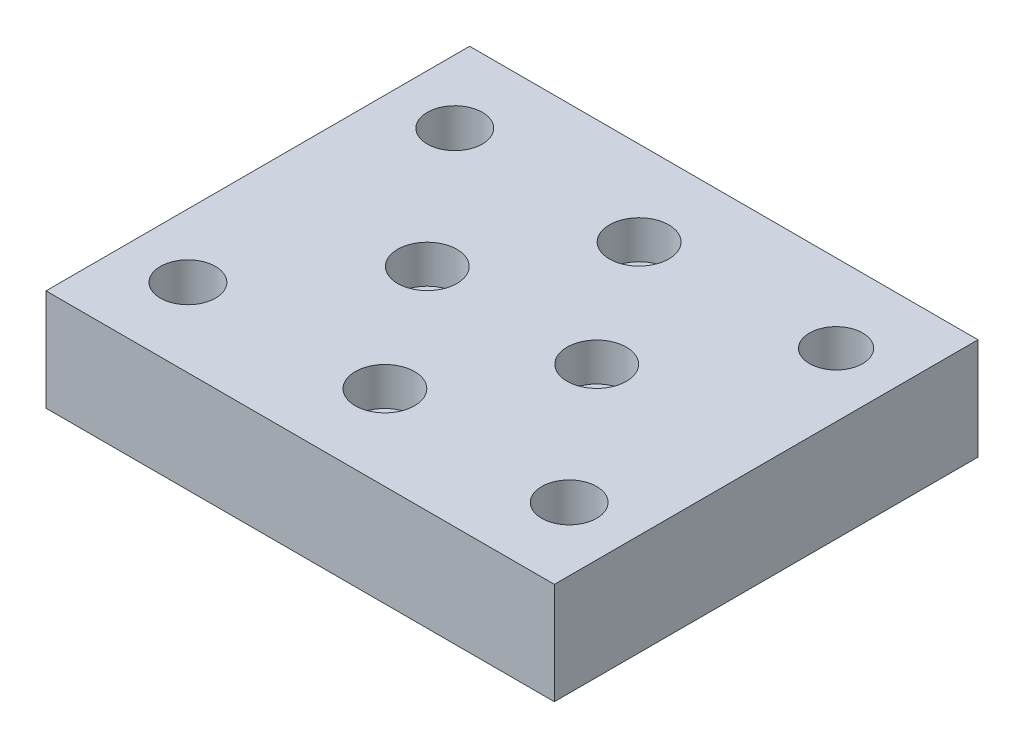
ISO-10303-21;
HEADER;
FILE_DESCRIPTION(('STEP AP214'),'2;1');
FILE_NAME('part.step','',(''),(''),'','','');
FILE_SCHEMA(('AUTOMOTIVE_DESIGN { 1 0 10303 214 1 1 1 1 }'));
ENDSEC;
DATA;
#1=APPLICATION_CONTEXT('core data for automotive mechanical design processes');
#2=APPLICATION_PROTOCOL_DEFINITION('international standard','automotive_design',2000,#1);
#3=PRODUCT_CONTEXT('',#1,'mechanical');
#4=PRODUCT('Part','Part','',(#3));
#5=PRODUCT_RELATED_PRODUCT_CATEGORY('part','',(#4));
#6=PRODUCT_DEFINITION_FORMATION('','',#4);
#7=PRODUCT_DEFINITION_CONTEXT('part definition',#1,'design');
#8=PRODUCT_DEFINITION('design','',#6,#7);
#9=PRODUCT_DEFINITION_SHAPE('','',#8);
#10=(LENGTH_UNIT() NAMED_UNIT(*) SI_UNIT(.MILLI.,.METRE.));
#11=(NAMED_UNIT(*) PLANE_ANGLE_UNIT() SI_UNIT($,.RADIAN.));
#12=(NAMED_UNIT(*) SI_UNIT($,.STERADIAN.) SOLID_ANGLE_UNIT());
#13=UNCERTAINTY_MEASURE_WITH_UNIT(LENGTH_MEASURE(1.E-05),#10,'distance_accuracy_value','');
#14=(GEOMETRIC_REPRESENTATION_CONTEXT(3) GLOBAL_UNCERTAINTY_ASSIGNED_CONTEXT((#13)) GLOBAL_UNIT_ASSIGNED_CONTEXT((#10,
#11,#12)) REPRESENTATION_CONTEXT('',''));
#15=CARTESIAN_POINT('',(0.,0.,0.));
#16=DIRECTION('',(0.,0.,1.));
#17=DIRECTION('',(1.,0.,0.));
#18=AXIS2_PLACEMENT_3D('',#15,#16,#17);
#19=CARTESIAN_POINT('',(-60.,24.,-50.));
#20=DIRECTION('',(1.,0.,0.));
#21=DIRECTION('',(0.,0.,-1.));
#22=AXIS2_PLACEMENT_3D('',#19,#20,#21);
#23=PLANE('',#22);
#24=DIRECTION('',(0.,0.,1.));
#25=VECTOR('',#24,1.);
#26=CARTESIAN_POINT('',(-60.,0.,-50.));
#27=LINE('',#26,#25);
#28=CARTESIAN_POINT('',(-60.,0.,-50.));
#29=VERTEX_POINT('',#28);
#30=CARTESIAN_POINT('',(-60.,0.,50.));
#31=VERTEX_POINT('',#30);
#32=EDGE_CURVE('E96',#29,#31,#27,.T.);
#33=ORIENTED_EDGE('',*,*,#32,.T.);
#34=DIRECTION('',(0.,-1.,0.));
#35=VECTOR('',#34,1.);
#36=CARTESIAN_POINT('',(-60.,24.,50.));
#37=LINE('',#36,#35);
#38=CARTESIAN_POINT('',(-60.,24.,50.));
#39=VERTEX_POINT('',#38);
#40=EDGE_CURVE('E11',#39,#31,#37,.T.);
#41=ORIENTED_EDGE('',*,*,#40,.F.);
#42=DIRECTION('',(0.,0.,1.));
#43=VECTOR('',#42,1.);
#44=CARTESIAN_POINT('',(-60.,24.,-50.));
#45=LINE('',#44,#43);
#46=CARTESIAN_POINT('',(-60.,24.,-50.));
#47=VERTEX_POINT('',#46);
#48=EDGE_CURVE('E84',#47,#39,#45,.T.);
#49=ORIENTED_EDGE('',*,*,#48,.F.);
#50=DIRECTION('',(0.,-1.,0.));
#51=VECTOR('',#50,1.);
#52=CARTESIAN_POINT('',(-60.,24.,-50.));
#53=LINE('',#52,#51);
#54=EDGE_CURVE('E92',#47,#29,#53,.T.);
#55=ORIENTED_EDGE('',*,*,#54,.T.);
#56=EDGE_LOOP('',(#33,#41,#49,#55));
#57=FACE_BOUND('',#56,.T.);
#58=ADVANCED_FACE('F33',(#57),#23,.F.);
#59=CARTESIAN_POINT('',(60.,24.,50.));
#60=DIRECTION('',(0.,0.,-1.));
#61=DIRECTION('',(-1.,0.,0.));
#62=AXIS2_PLACEMENT_3D('',#59,#60,#61);
#63=PLANE('',#62);
#64=DIRECTION('',(1.,0.,0.));
#65=VECTOR('',#64,1.);
#66=CARTESIAN_POINT('',(60.,0.,50.));
#67=LINE('',#66,#65);
#68=CARTESIAN_POINT('',(60.,0.,50.));
#69=VERTEX_POINT('',#68);
#70=EDGE_CURVE('E88',#31,#69,#67,.T.);
#71=ORIENTED_EDGE('',*,*,#70,.T.);
#72=DIRECTION('',(0.,-1.,0.));
#73=VECTOR('',#72,1.);
#74=CARTESIAN_POINT('',(60.,24.,50.));
#75=LINE('',#74,#73);
#76=CARTESIAN_POINT('',(60.,24.,50.));
#77=VERTEX_POINT('',#76);
#78=EDGE_CURVE('E41',#77,#69,#75,.T.);
#79=ORIENTED_EDGE('',*,*,#78,.F.);
#80=DIRECTION('',(1.,0.,0.));
#81=VECTOR('',#80,1.);
#82=CARTESIAN_POINT('',(60.,24.,50.));
#83=LINE('',#82,#81);
#84=EDGE_CURVE('E79',#39,#77,#83,.T.);
#85=ORIENTED_EDGE('',*,*,#84,.F.);
#86=ORIENTED_EDGE('',*,*,#40,.T.);
#87=EDGE_LOOP('',(#71,#79,#85,#86));
#88=FACE_BOUND('',#87,.T.);
#89=ADVANCED_FACE('F87',(#88),#63,.F.);
#90=CARTESIAN_POINT('',(60.,24.,-50.));
#91=DIRECTION('',(-1.,0.,0.));
#92=DIRECTION('',(0.,0.,1.));
#93=AXIS2_PLACEMENT_3D('',#90,#91,#92);
#94=PLANE('',#93);
#95=DIRECTION('',(0.,0.,-1.));
#96=VECTOR('',#95,1.);
#97=CARTESIAN_POINT('',(60.,0.,-50.));
#98=LINE('',#97,#96);
#99=CARTESIAN_POINT('',(60.,0.,-50.));
#100=VERTEX_POINT('',#99);
#101=EDGE_CURVE('E66',#69,#100,#98,.T.);
#102=ORIENTED_EDGE('',*,*,#101,.T.);
#103=DIRECTION('',(0.,-1.,0.));
#104=VECTOR('',#103,1.);
#105=CARTESIAN_POINT('',(60.,24.,-50.));
#106=LINE('',#105,#104);
#107=CARTESIAN_POINT('',(60.,24.,-50.));
#108=VERTEX_POINT('',#107);
#109=EDGE_CURVE('E89',#108,#100,#106,.T.);
#110=ORIENTED_EDGE('',*,*,#109,.F.);
#111=DIRECTION('',(0.,0.,-1.));
#112=VECTOR('',#111,1.);
#113=CARTESIAN_POINT('',(60.,24.,-50.));
#114=LINE('',#113,#112);
#115=EDGE_CURVE('E82',#77,#108,#114,.T.);
#116=ORIENTED_EDGE('',*,*,#115,.F.);
#117=ORIENTED_EDGE('',*,*,#78,.T.);
#118=EDGE_LOOP('',(#102,#110,#116,#117));
#119=FACE_BOUND('',#118,.T.);
#120=ADVANCED_FACE('F90',(#119),#94,.F.);
#121=CARTESIAN_POINT('',(60.,24.,-50.));
#122=DIRECTION('',(0.,0.,1.));
#123=DIRECTION('',(1.,0.,0.));
#124=AXIS2_PLACEMENT_3D('',#121,#122,#123);
#125=PLANE('',#124);
#126=DIRECTION('',(-1.,0.,0.));
#127=VECTOR('',#126,1.);
#128=CARTESIAN_POINT('',(60.,0.,-50.));
#129=LINE('',#128,#127);
#130=EDGE_CURVE('E72',#100,#29,#129,.T.);
#131=ORIENTED_EDGE('',*,*,#130,.T.);
#132=ORIENTED_EDGE('',*,*,#54,.F.);
#133=DIRECTION('',(-1.,0.,0.));
#134=VECTOR('',#133,1.);
#135=CARTESIAN_POINT('',(60.,24.,-50.));
#136=LINE('',#135,#134);
#137=EDGE_CURVE('E49',#108,#47,#136,.T.);
#138=ORIENTED_EDGE('',*,*,#137,.F.);
#139=ORIENTED_EDGE('',*,*,#109,.T.);
#140=EDGE_LOOP('',(#131,#132,#138,#139));
#141=FACE_BOUND('',#140,.T.);
#142=ADVANCED_FACE('F104',(#141),#125,.F.);
#143=CARTESIAN_POINT('',(0.,24.,0.));
#144=DIRECTION('',(0.,-1.,0.));
#145=DIRECTION('',(0.,0.,-1.));
#146=AXIS2_PLACEMENT_3D('',#143,#144,#145);
#147=PLANE('',#146);
#148=CARTESIAN_POINT('',(45.,24.,-31.5));
#149=DIRECTION('',(0.,-1.,0.));
#150=DIRECTION('',(0.,0.,-1.));
#151=AXIS2_PLACEMENT_3D('',#148,#149,#150);
#152=CIRCLE('',#151,6.27689553203042);
#153=CARTESIAN_POINT('',(45.,24.,-37.7768955320304));
#154=VERTEX_POINT('',#153);
#155=EDGE_CURVE('E197',#154,#154,#152,.T.);
#156=ORIENTED_EDGE('',*,*,#155,.T.);
#157=EDGE_LOOP('',(#156));
#158=FACE_BOUND('',#157,.T.);
#159=CARTESIAN_POINT('',(-45.,24.,-31.5));
#160=DIRECTION('',(0.,-1.,0.));
#161=DIRECTION('',(0.,0.,-1.));
#162=AXIS2_PLACEMENT_3D('',#159,#160,#161);
#163=CIRCLE('',#162,6.5);
#164=CARTESIAN_POINT('',(-45.,24.,-38.));
#165=VERTEX_POINT('',#164);
#166=EDGE_CURVE('E191',#165,#165,#163,.T.);
#167=ORIENTED_EDGE('',*,*,#166,.T.);
#168=EDGE_LOOP('',(#167));
#169=FACE_BOUND('',#168,.T.);
#170=CARTESIAN_POINT('',(45.,24.,31.5));
#171=DIRECTION('',(0.,-1.,0.));
#172=DIRECTION('',(0.,0.,-1.));
#173=AXIS2_PLACEMENT_3D('',#170,#171,#172);
#174=CIRCLE('',#173,6.5);
#175=CARTESIAN_POINT('',(45.,24.,25.));
#176=VERTEX_POINT('',#175);
#177=EDGE_CURVE('E185',#176,#176,#174,.T.);
#178=ORIENTED_EDGE('',*,*,#177,.T.);
#179=EDGE_LOOP('',(#178));
#180=FACE_BOUND('',#179,.T.);
#181=CARTESIAN_POINT('',(-45.,24.,31.5));
#182=DIRECTION('',(0.,-1.,0.));
#183=DIRECTION('',(0.,0.,-1.));
#184=AXIS2_PLACEMENT_3D('',#181,#182,#183);
#185=CIRCLE('',#184,6.5);
#186=CARTESIAN_POINT('',(-45.,24.,25.));
#187=VERTEX_POINT('',#186);
#188=EDGE_CURVE('E179',#187,#187,#185,.T.);
#189=ORIENTED_EDGE('',*,*,#188,.T.);
#190=EDGE_LOOP('',(#189));
#191=FACE_BOUND('',#190,.T.);
#192=CARTESIAN_POINT('',(20.,24.,0.));
#193=DIRECTION('',(0.,1.,0.));
#194=DIRECTION('',(0.,0.,1.));
#195=AXIS2_PLACEMENT_3D('',#192,#193,#194);
#196=CIRCLE('',#195,7.);
#197=CARTESIAN_POINT('',(20.,24.,7.));
#198=VERTEX_POINT('',#197);
#199=EDGE_CURVE('E128',#198,#198,#196,.T.);
#200=ORIENTED_EDGE('',*,*,#199,.F.);
#201=EDGE_LOOP('',(#200));
#202=FACE_BOUND('',#201,.T.);
#203=CARTESIAN_POINT('',(-20.,24.,0.));
#204=DIRECTION('',(0.,1.,0.));
#205=DIRECTION('',(0.,0.,1.));
#206=AXIS2_PLACEMENT_3D('',#203,#204,#205);
#207=CIRCLE('',#206,7.);
#208=CARTESIAN_POINT('',(-20.,24.,7.));
#209=VERTEX_POINT('',#208);
#210=EDGE_CURVE('E122',#209,#209,#207,.T.);
#211=ORIENTED_EDGE('',*,*,#210,.F.);
#212=EDGE_LOOP('',(#211));
#213=FACE_BOUND('',#212,.T.);
#214=CARTESIAN_POINT('',(0.,24.,30.));
#215=DIRECTION('',(0.,1.,0.));
#216=DIRECTION('',(0.,0.,1.));
#217=AXIS2_PLACEMENT_3D('',#214,#215,#216);
#218=CIRCLE('',#217,7.);
#219=CARTESIAN_POINT('',(0.,24.,37.));
#220=VERTEX_POINT('',#219);
#221=EDGE_CURVE('E116',#220,#220,#218,.T.);
#222=ORIENTED_EDGE('',*,*,#221,.F.);
#223=EDGE_LOOP('',(#222));
#224=FACE_BOUND('',#223,.T.);
#225=CARTESIAN_POINT('',(0.,24.,-30.));
#226=DIRECTION('',(0.,1.,0.));
#227=DIRECTION('',(0.,0.,1.));
#228=AXIS2_PLACEMENT_3D('',#225,#226,#227);
#229=CIRCLE('',#228,7.);
#230=CARTESIAN_POINT('',(0.,24.,-23.));
#231=VERTEX_POINT('',#230);
#232=EDGE_CURVE('E110',#231,#231,#229,.T.);
#233=ORIENTED_EDGE('',*,*,#232,.F.);
#234=EDGE_LOOP('',(#233));
#235=FACE_BOUND('',#234,.T.);
#236=ORIENTED_EDGE('',*,*,#48,.T.);
#237=ORIENTED_EDGE('',*,*,#84,.T.);
#238=ORIENTED_EDGE('',*,*,#115,.T.);
#239=ORIENTED_EDGE('',*,*,#137,.T.);
#240=EDGE_LOOP('',(#236,#237,#238,#239));
#241=FACE_BOUND('',#240,.T.);
#242=ADVANCED_FACE('F80',(#158,#169,#180,#191,#202,#213,#224,#235,#241),#147,.F.);
#243=CARTESIAN_POINT('',(0.,0.,0.));
#244=DIRECTION('',(0.,-1.,0.));
#245=DIRECTION('',(0.,0.,-1.));
#246=AXIS2_PLACEMENT_3D('',#243,#244,#245);
#247=PLANE('',#246);
#248=CARTESIAN_POINT('',(-45.,0.,-31.5));
#249=DIRECTION('',(0.,-1.,0.));
#250=DIRECTION('',(0.,0.,-1.));
#251=AXIS2_PLACEMENT_3D('',#248,#249,#250);
#252=CIRCLE('',#251,9.5);
#253=CARTESIAN_POINT('',(-45.,0.,-41.));
#254=VERTEX_POINT('',#253);
#255=EDGE_CURVE('E176',#254,#254,#252,.T.);
#256=ORIENTED_EDGE('',*,*,#255,.F.);
#257=EDGE_LOOP('',(#256));
#258=FACE_BOUND('',#257,.T.);
#259=CARTESIAN_POINT('',(45.,0.,-31.5));
#260=DIRECTION('',(0.,-1.,0.));
#261=DIRECTION('',(0.,0.,-1.));
#262=AXIS2_PLACEMENT_3D('',#259,#260,#261);
#263=CIRCLE('',#262,9.5);
#264=CARTESIAN_POINT('',(45.,0.,-41.));
#265=VERTEX_POINT('',#264);
#266=EDGE_CURVE('E170',#265,#265,#263,.T.);
#267=ORIENTED_EDGE('',*,*,#266,.F.);
#268=EDGE_LOOP('',(#267));
#269=FACE_BOUND('',#268,.T.);
#270=CARTESIAN_POINT('',(45.,0.,31.5));
#271=DIRECTION('',(0.,-1.,0.));
#272=DIRECTION('',(0.,0.,-1.));
#273=AXIS2_PLACEMENT_3D('',#270,#271,#272);
#274=CIRCLE('',#273,9.5);
#275=CARTESIAN_POINT('',(45.,0.,22.));
#276=VERTEX_POINT('',#275);
#277=EDGE_CURVE('E164',#276,#276,#274,.T.);
#278=ORIENTED_EDGE('',*,*,#277,.F.);
#279=EDGE_LOOP('',(#278));
#280=FACE_BOUND('',#279,.T.);
#281=CARTESIAN_POINT('',(-45.,0.,31.5));
#282=DIRECTION('',(0.,-1.,0.));
#283=DIRECTION('',(0.,0.,-1.));
#284=AXIS2_PLACEMENT_3D('',#281,#282,#283);
#285=CIRCLE('',#284,9.5);
#286=CARTESIAN_POINT('',(-45.,0.,22.));
#287=VERTEX_POINT('',#286);
#288=EDGE_CURVE('E158',#287,#287,#285,.T.);
#289=ORIENTED_EDGE('',*,*,#288,.F.);
#290=EDGE_LOOP('',(#289));
#291=FACE_BOUND('',#290,.T.);
#292=CARTESIAN_POINT('',(0.,0.,30.));
#293=DIRECTION('',(0.,-1.,0.));
#294=DIRECTION('',(0.,0.,-1.));
#295=AXIS2_PLACEMENT_3D('',#292,#293,#294);
#296=CIRCLE('',#295,4.5);
#297=CARTESIAN_POINT('',(0.,0.,25.5));
#298=VERTEX_POINT('',#297);
#299=EDGE_CURVE('E152',#298,#298,#296,.F.);
#300=ORIENTED_EDGE('',*,*,#299,.T.);
#301=EDGE_LOOP('',(#300));
#302=FACE_BOUND('',#301,.T.);
#303=CARTESIAN_POINT('',(20.,0.,0.));
#304=DIRECTION('',(0.,-1.,0.));
#305=DIRECTION('',(0.,0.,-1.));
#306=AXIS2_PLACEMENT_3D('',#303,#304,#305);
#307=CIRCLE('',#306,4.5);
#308=CARTESIAN_POINT('',(20.,0.,-4.5));
#309=VERTEX_POINT('',#308);
#310=EDGE_CURVE('E146',#309,#309,#307,.F.);
#311=ORIENTED_EDGE('',*,*,#310,.T.);
#312=EDGE_LOOP('',(#311));
#313=FACE_BOUND('',#312,.T.);
#314=CARTESIAN_POINT('',(0.,0.,-30.));
#315=DIRECTION('',(0.,-1.,0.));
#316=DIRECTION('',(0.,0.,-1.));
#317=AXIS2_PLACEMENT_3D('',#314,#315,#316);
#318=CIRCLE('',#317,4.5);
#319=CARTESIAN_POINT('',(0.,0.,-34.5));
#320=VERTEX_POINT('',#319);
#321=EDGE_CURVE('E140',#320,#320,#318,.F.);
#322=ORIENTED_EDGE('',*,*,#321,.T.);
#323=EDGE_LOOP('',(#322));
#324=FACE_BOUND('',#323,.T.);
#325=CARTESIAN_POINT('',(-20.,0.,0.));
#326=DIRECTION('',(0.,-1.,0.));
#327=DIRECTION('',(0.,0.,-1.));
#328=AXIS2_PLACEMENT_3D('',#325,#326,#327);
#329=CIRCLE('',#328,4.5);
#330=CARTESIAN_POINT('',(-20.,0.,-4.5));
#331=VERTEX_POINT('',#330);
#332=EDGE_CURVE('E134',#331,#331,#329,.F.);
#333=ORIENTED_EDGE('',*,*,#332,.T.);
#334=EDGE_LOOP('',(#333));
#335=FACE_BOUND('',#334,.T.);
#336=ORIENTED_EDGE('',*,*,#32,.F.);
#337=ORIENTED_EDGE('',*,*,#130,.F.);
#338=ORIENTED_EDGE('',*,*,#101,.F.);
#339=ORIENTED_EDGE('',*,*,#70,.F.);
#340=EDGE_LOOP('',(#336,#337,#338,#339));
#341=FACE_BOUND('',#340,.T.);
#342=ADVANCED_FACE('F107',(#258,#269,#280,#291,#302,#313,#324,#335,#341),#247,.T.);
#343=CARTESIAN_POINT('',(0.,15.,-30.));
#344=DIRECTION('',(0.,1.,0.));
#345=DIRECTION('',(0.,0.,1.));
#346=AXIS2_PLACEMENT_3D('',#343,#344,#345);
#347=CYLINDRICAL_SURFACE('',#346,7.);
#348=CARTESIAN_POINT('',(0.,15.,-30.));
#349=DIRECTION('',(0.,1.,0.));
#350=DIRECTION('',(0.,0.,1.));
#351=AXIS2_PLACEMENT_3D('',#348,#349,#350);
#352=CIRCLE('',#351,7.);
#353=CARTESIAN_POINT('',(0.,15.,-23.));
#354=VERTEX_POINT('',#353);
#355=EDGE_CURVE('E99',#354,#354,#352,.T.);
#356=ORIENTED_EDGE('',*,*,#355,.F.);
#357=EDGE_LOOP('',(#356));
#358=FACE_BOUND('',#357,.T.);
#359=ORIENTED_EDGE('',*,*,#232,.T.);
#360=EDGE_LOOP('',(#359));
#361=FACE_BOUND('',#360,.T.);
#362=ADVANCED_FACE('F231',(#358,#361),#347,.F.);
#363=CARTESIAN_POINT('',(0.,15.,-30.));
#364=DIRECTION('',(0.,1.,0.));
#365=DIRECTION('',(0.,0.,1.));
#366=AXIS2_PLACEMENT_3D('',#363,#364,#365);
#367=PLANE('',#366);
#368=CARTESIAN_POINT('',(0.,15.,-30.));
#369=DIRECTION('',(0.,1.,0.));
#370=DIRECTION('',(0.,0.,1.));
#371=AXIS2_PLACEMENT_3D('',#368,#369,#370);
#372=CIRCLE('',#371,4.5);
#373=CARTESIAN_POINT('',(0.,15.,-25.5));
#374=VERTEX_POINT('',#373);
#375=EDGE_CURVE('E137',#374,#374,#372,.T.);
#376=ORIENTED_EDGE('',*,*,#375,.F.);
#377=EDGE_LOOP('',(#376));
#378=FACE_BOUND('',#377,.T.);
#379=ORIENTED_EDGE('',*,*,#355,.T.);
#380=EDGE_LOOP('',(#379));
#381=FACE_BOUND('',#380,.T.);
#382=ADVANCED_FACE('F276',(#378,#381),#367,.T.);
#383=CARTESIAN_POINT('',(0.,15.,30.));
#384=DIRECTION('',(0.,1.,0.));
#385=DIRECTION('',(0.,0.,1.));
#386=AXIS2_PLACEMENT_3D('',#383,#384,#385);
#387=CYLINDRICAL_SURFACE('',#386,7.);
#388=CARTESIAN_POINT('',(0.,15.,30.));
#389=DIRECTION('',(0.,1.,0.));
#390=DIRECTION('',(0.,0.,1.));
#391=AXIS2_PLACEMENT_3D('',#388,#389,#390);
#392=CIRCLE('',#391,7.);
#393=CARTESIAN_POINT('',(0.,15.,37.));
#394=VERTEX_POINT('',#393);
#395=EDGE_CURVE('E113',#394,#394,#392,.T.);
#396=ORIENTED_EDGE('',*,*,#395,.F.);
#397=EDGE_LOOP('',(#396));
#398=FACE_BOUND('',#397,.T.);
#399=ORIENTED_EDGE('',*,*,#221,.T.);
#400=EDGE_LOOP('',(#399));
#401=FACE_BOUND('',#400,.T.);
#402=ADVANCED_FACE('F282',(#398,#401),#387,.F.);
#403=CARTESIAN_POINT('',(0.,15.,30.));
#404=DIRECTION('',(0.,1.,0.));
#405=DIRECTION('',(0.,0.,1.));
#406=AXIS2_PLACEMENT_3D('',#403,#404,#405);
#407=PLANE('',#406);
#408=CARTESIAN_POINT('',(0.,15.,30.));
#409=DIRECTION('',(0.,1.,0.));
#410=DIRECTION('',(0.,0.,1.));
#411=AXIS2_PLACEMENT_3D('',#408,#409,#410);
#412=CIRCLE('',#411,4.5);
#413=CARTESIAN_POINT('',(0.,15.,34.5));
#414=VERTEX_POINT('',#413);
#415=EDGE_CURVE('E149',#414,#414,#412,.T.);
#416=ORIENTED_EDGE('',*,*,#415,.F.);
#417=EDGE_LOOP('',(#416));
#418=FACE_BOUND('',#417,.T.);
#419=ORIENTED_EDGE('',*,*,#395,.T.);
#420=EDGE_LOOP('',(#419));
#421=FACE_BOUND('',#420,.T.);
#422=ADVANCED_FACE('F264',(#418,#421),#407,.T.);
#423=CARTESIAN_POINT('',(-20.,15.,0.));
#424=DIRECTION('',(0.,1.,0.));
#425=DIRECTION('',(0.,0.,1.));
#426=AXIS2_PLACEMENT_3D('',#423,#424,#425);
#427=CYLINDRICAL_SURFACE('',#426,7.);
#428=CARTESIAN_POINT('',(-20.,15.,0.));
#429=DIRECTION('',(0.,1.,0.));
#430=DIRECTION('',(0.,0.,1.));
#431=AXIS2_PLACEMENT_3D('',#428,#429,#430);
#432=CIRCLE('',#431,7.);
#433=CARTESIAN_POINT('',(-20.,15.,7.));
#434=VERTEX_POINT('',#433);
#435=EDGE_CURVE('E119',#434,#434,#432,.T.);
#436=ORIENTED_EDGE('',*,*,#435,.F.);
#437=EDGE_LOOP('',(#436));
#438=FACE_BOUND('',#437,.T.);
#439=ORIENTED_EDGE('',*,*,#210,.T.);
#440=EDGE_LOOP('',(#439));
#441=FACE_BOUND('',#440,.T.);
#442=ADVANCED_FACE('F258',(#438,#441),#427,.F.);
#443=CARTESIAN_POINT('',(-20.,15.,0.));
#444=DIRECTION('',(0.,1.,0.));
#445=DIRECTION('',(0.,0.,1.));
#446=AXIS2_PLACEMENT_3D('',#443,#444,#445);
#447=PLANE('',#446);
#448=CARTESIAN_POINT('',(-20.,15.,0.));
#449=DIRECTION('',(0.,1.,0.));
#450=DIRECTION('',(0.,0.,1.));
#451=AXIS2_PLACEMENT_3D('',#448,#449,#450);
#452=CIRCLE('',#451,4.5);
#453=CARTESIAN_POINT('',(-20.,15.,4.5));
#454=VERTEX_POINT('',#453);
#455=EDGE_CURVE('E131',#454,#454,#452,.T.);
#456=ORIENTED_EDGE('',*,*,#455,.F.);
#457=EDGE_LOOP('',(#456));
#458=FACE_BOUND('',#457,.T.);
#459=ORIENTED_EDGE('',*,*,#435,.T.);
#460=EDGE_LOOP('',(#459));
#461=FACE_BOUND('',#460,.T.);
#462=ADVANCED_FACE('F254',(#458,#461),#447,.T.);
#463=CARTESIAN_POINT('',(20.,15.,0.));
#464=DIRECTION('',(0.,1.,0.));
#465=DIRECTION('',(0.,0.,1.));
#466=AXIS2_PLACEMENT_3D('',#463,#464,#465);
#467=CYLINDRICAL_SURFACE('',#466,7.);
#468=CARTESIAN_POINT('',(20.,15.,0.));
#469=DIRECTION('',(0.,1.,0.));
#470=DIRECTION('',(0.,0.,1.));
#471=AXIS2_PLACEMENT_3D('',#468,#469,#470);
#472=CIRCLE('',#471,7.);
#473=CARTESIAN_POINT('',(20.,15.,7.));
#474=VERTEX_POINT('',#473);
#475=EDGE_CURVE('E125',#474,#474,#472,.T.);
#476=ORIENTED_EDGE('',*,*,#475,.F.);
#477=EDGE_LOOP('',(#476));
#478=FACE_BOUND('',#477,.T.);
#479=ORIENTED_EDGE('',*,*,#199,.T.);
#480=EDGE_LOOP('',(#479));
#481=FACE_BOUND('',#480,.T.);
#482=ADVANCED_FACE('F257',(#478,#481),#467,.F.);
#483=CARTESIAN_POINT('',(20.,15.,0.));
#484=DIRECTION('',(0.,1.,0.));
#485=DIRECTION('',(0.,0.,1.));
#486=AXIS2_PLACEMENT_3D('',#483,#484,#485);
#487=PLANE('',#486);
#488=CARTESIAN_POINT('',(20.,15.,0.));
#489=DIRECTION('',(0.,1.,0.));
#490=DIRECTION('',(0.,0.,1.));
#491=AXIS2_PLACEMENT_3D('',#488,#489,#490);
#492=CIRCLE('',#491,4.5);
#493=CARTESIAN_POINT('',(20.,15.,4.5));
#494=VERTEX_POINT('',#493);
#495=EDGE_CURVE('E143',#494,#494,#492,.T.);
#496=ORIENTED_EDGE('',*,*,#495,.F.);
#497=EDGE_LOOP('',(#496));
#498=FACE_BOUND('',#497,.T.);
#499=ORIENTED_EDGE('',*,*,#475,.T.);
#500=EDGE_LOOP('',(#499));
#501=FACE_BOUND('',#500,.T.);
#502=ADVANCED_FACE('F250',(#498,#501),#487,.T.);
#503=CARTESIAN_POINT('',(-20.,-0.000999999999999265,0.));
#504=DIRECTION('',(0.,1.,0.));
#505=DIRECTION('',(0.,0.,1.));
#506=AXIS2_PLACEMENT_3D('',#503,#504,#505);
#507=CYLINDRICAL_SURFACE('',#506,4.5);
#508=ORIENTED_EDGE('',*,*,#332,.F.);
#509=EDGE_LOOP('',(#508));
#510=FACE_BOUND('',#509,.T.);
#511=ORIENTED_EDGE('',*,*,#455,.T.);
#512=EDGE_LOOP('',(#511));
#513=FACE_BOUND('',#512,.T.);
#514=ADVANCED_FACE('F246',(#510,#513),#507,.F.);
#515=CARTESIAN_POINT('',(0.,-0.000999999999999265,-30.));
#516=DIRECTION('',(0.,1.,0.));
#517=DIRECTION('',(0.,0.,1.));
#518=AXIS2_PLACEMENT_3D('',#515,#516,#517);
#519=CYLINDRICAL_SURFACE('',#518,4.5);
#520=ORIENTED_EDGE('',*,*,#321,.F.);
#521=EDGE_LOOP('',(#520));
#522=FACE_BOUND('',#521,.T.);
#523=ORIENTED_EDGE('',*,*,#375,.T.);
#524=EDGE_LOOP('',(#523));
#525=FACE_BOUND('',#524,.T.);
#526=ADVANCED_FACE('F249',(#522,#525),#519,.F.);
#527=CARTESIAN_POINT('',(20.,-0.000999999999999265,0.));
#528=DIRECTION('',(0.,1.,0.));
#529=DIRECTION('',(0.,0.,1.));
#530=AXIS2_PLACEMENT_3D('',#527,#528,#529);
#531=CYLINDRICAL_SURFACE('',#530,4.5);
#532=ORIENTED_EDGE('',*,*,#310,.F.);
#533=EDGE_LOOP('',(#532));
#534=FACE_BOUND('',#533,.T.);
#535=ORIENTED_EDGE('',*,*,#495,.T.);
#536=EDGE_LOOP('',(#535));
#537=FACE_BOUND('',#536,.T.);
#538=ADVANCED_FACE('F416',(#534,#537),#531,.F.);
#539=CARTESIAN_POINT('',(0.,-0.000999999999999265,30.));
#540=DIRECTION('',(0.,1.,0.));
#541=DIRECTION('',(0.,0.,1.));
#542=AXIS2_PLACEMENT_3D('',#539,#540,#541);
#543=CYLINDRICAL_SURFACE('',#542,4.5);
#544=ORIENTED_EDGE('',*,*,#299,.F.);
#545=EDGE_LOOP('',(#544));
#546=FACE_BOUND('',#545,.T.);
#547=ORIENTED_EDGE('',*,*,#415,.T.);
#548=EDGE_LOOP('',(#547));
#549=FACE_BOUND('',#548,.T.);
#550=ADVANCED_FACE('F317',(#546,#549),#543,.F.);
#551=CARTESIAN_POINT('',(-45.,13.,31.5));
#552=DIRECTION('',(0.,-1.,0.));
#553=DIRECTION('',(0.,0.,-1.));
#554=AXIS2_PLACEMENT_3D('',#551,#552,#553);
#555=CYLINDRICAL_SURFACE('',#554,9.5);
#556=CARTESIAN_POINT('',(-45.,13.,31.5));
#557=DIRECTION('',(0.,-1.,0.));
#558=DIRECTION('',(0.,0.,-1.));
#559=AXIS2_PLACEMENT_3D('',#556,#557,#558);
#560=CIRCLE('',#559,9.5);
#561=CARTESIAN_POINT('',(-45.,13.,22.));
#562=VERTEX_POINT('',#561);
#563=EDGE_CURVE('E155',#562,#562,#560,.T.);
#564=CARTESIAN_POINT('',(-45.,13.,22.));
#565=CARTESIAN_POINT('',(-45.,12.8645833333333,22.));
#566=CARTESIAN_POINT('',(-45.,12.7291666666667,22.));
#567=CARTESIAN_POINT('',(-45.,12.4583333333333,22.));
#568=CARTESIAN_POINT('',(-45.,12.3229166666667,22.));
#569=CARTESIAN_POINT('',(-45.,12.0520833333333,22.));
#570=CARTESIAN_POINT('',(-45.,11.9166666666667,22.));
#571=CARTESIAN_POINT('',(-45.,11.6458333333333,22.));
#572=CARTESIAN_POINT('',(-45.,11.5104166666667,22.));
#573=CARTESIAN_POINT('',(-45.,11.2395833333333,22.));
#574=CARTESIAN_POINT('',(-45.,11.1041666666667,22.));
#575=CARTESIAN_POINT('',(-45.,10.8333333333333,22.));
#576=CARTESIAN_POINT('',(-45.,10.6979166666667,22.));
#577=CARTESIAN_POINT('',(-45.,10.4270833333333,22.));
#578=CARTESIAN_POINT('',(-45.,10.2916666666667,22.));
#579=CARTESIAN_POINT('',(-45.,10.0208333333333,22.));
#580=CARTESIAN_POINT('',(-45.,9.88541666666667,22.));
#581=CARTESIAN_POINT('',(-45.,9.61458333333333,22.));
#582=CARTESIAN_POINT('',(-45.,9.47916666666667,22.));
#583=CARTESIAN_POINT('',(-45.,9.20833333333333,22.));
#584=CARTESIAN_POINT('',(-45.,9.07291666666667,22.));
#585=CARTESIAN_POINT('',(-45.,8.80208333333333,22.));
#586=CARTESIAN_POINT('',(-45.,8.66666666666667,22.));
#587=CARTESIAN_POINT('',(-45.,8.39583333333333,22.));
#588=CARTESIAN_POINT('',(-45.,8.26041666666667,22.));
#589=CARTESIAN_POINT('',(-45.,7.98958333333333,22.));
#590=CARTESIAN_POINT('',(-45.,7.85416666666667,22.));
#591=CARTESIAN_POINT('',(-45.,7.58333333333333,22.));
#592=CARTESIAN_POINT('',(-45.,7.44791666666667,22.));
#593=CARTESIAN_POINT('',(-45.,7.17708333333333,22.));
#594=CARTESIAN_POINT('',(-45.,7.04166666666667,22.));
#595=CARTESIAN_POINT('',(-45.,6.77083333333333,22.));
#596=CARTESIAN_POINT('',(-45.,6.63541666666667,22.));
#597=CARTESIAN_POINT('',(-45.,6.36458333333333,22.));
#598=CARTESIAN_POINT('',(-45.,6.22916666666667,22.));
#599=CARTESIAN_POINT('',(-45.,5.95833333333333,22.));
#600=CARTESIAN_POINT('',(-45.,5.82291666666667,22.));
#601=CARTESIAN_POINT('',(-45.,5.55208333333333,22.));
#602=CARTESIAN_POINT('',(-45.,5.41666666666667,22.));
#603=CARTESIAN_POINT('',(-45.,5.14583333333333,22.));
#604=CARTESIAN_POINT('',(-45.,5.01041666666667,22.));
#605=CARTESIAN_POINT('',(-45.,4.73958333333333,22.));
#606=CARTESIAN_POINT('',(-45.,4.60416666666667,22.));
#607=CARTESIAN_POINT('',(-45.,4.33333333333333,22.));
#608=CARTESIAN_POINT('',(-45.,4.19791666666667,22.));
#609=CARTESIAN_POINT('',(-45.,3.92708333333333,22.));
#610=CARTESIAN_POINT('',(-45.,3.79166666666667,22.));
#611=CARTESIAN_POINT('',(-45.,3.52083333333333,22.));
#612=CARTESIAN_POINT('',(-45.,3.38541666666667,22.));
#613=CARTESIAN_POINT('',(-45.,3.11458333333333,22.));
#614=CARTESIAN_POINT('',(-45.,2.97916666666667,22.));
#615=CARTESIAN_POINT('',(-45.,2.70833333333333,22.));
#616=CARTESIAN_POINT('',(-45.,2.57291666666667,22.));
#617=CARTESIAN_POINT('',(-45.,2.30208333333333,22.));
#618=CARTESIAN_POINT('',(-45.,2.16666666666667,22.));
#619=CARTESIAN_POINT('',(-45.,1.89583333333333,22.));
#620=CARTESIAN_POINT('',(-45.,1.76041666666667,22.));
#621=CARTESIAN_POINT('',(-45.,1.48958333333333,22.));
#622=CARTESIAN_POINT('',(-45.,1.35416666666667,22.));
#623=CARTESIAN_POINT('',(-45.,1.08333333333333,22.));
#624=CARTESIAN_POINT('',(-45.,0.947916666666667,22.));
#625=CARTESIAN_POINT('',(-45.,0.677083333333334,22.));
#626=CARTESIAN_POINT('',(-45.,0.541666666666667,22.));
#627=CARTESIAN_POINT('',(-45.,0.270833333333334,22.));
#628=CARTESIAN_POINT('',(-45.,0.135416666666667,22.));
#629=CARTESIAN_POINT('',(-45.,0.,22.));
#630=B_SPLINE_CURVE_WITH_KNOTS('',3,(#564,#565,#566,#567,#568,#569,#570,#571,#572,#573,#574,
#575,#576,#577,#578,#579,#580,#581,#582,#583,#584,#585,#586,#587,#588,#589,#590,#591,#592,#593,
#594,#595,#596,#597,#598,#599,#600,#601,#602,#603,#604,#605,#606,#607,#608,#609,#610,#611,#612,
#613,#614,#615,#616,#617,#618,#619,#620,#621,#622,#623,#624,#625,#626,#627,#628,#629),
.UNSPECIFIED.,.F.,.F.,(4,2,2,2,2,2,2,2,2,2,2,2,2,2,2,2,2,2,2,2,2,2,2,2,2,2,2,2,2,2,2,2,4),(0.,
0.406249999999999,0.812499999999999,1.21875,1.625,2.03125,2.4375,2.84375,3.25,3.65625,4.0625,
4.46875,4.875,5.28125,5.6875,6.09375,6.5,6.90625,7.3125,7.71875,8.125,8.53125,8.9375,9.34375,
9.75,10.15625,10.5625,10.96875,11.375,11.78125,12.1875,12.59375,13.),.UNSPECIFIED.);
#631=EDGE_CURVE('BSEAM322',#562,#287,#630,.T.);
#632=ORIENTED_EDGE('',*,*,#563,.F.);
#633=ORIENTED_EDGE('',*,*,#288,.T.);
#634=ORIENTED_EDGE('',*,*,#631,.T.);
#635=ORIENTED_EDGE('',*,*,#631,.F.);
#636=EDGE_LOOP('',(#632,#634,#633,#635));
#637=FACE_BOUND('',#636,.T.);
#638=ADVANCED_FACE('F322',(#637),#555,.F.);
#639=CARTESIAN_POINT('',(-45.,13.,31.5));
#640=DIRECTION('',(0.,-1.,0.));
#641=DIRECTION('',(0.,0.,-1.));
#642=AXIS2_PLACEMENT_3D('',#639,#640,#641);
#643=PLANE('',#642);
#644=CARTESIAN_POINT('',(-45.,13.,31.5));
#645=DIRECTION('',(0.,-1.,0.));
#646=DIRECTION('',(0.,0.,-1.));
#647=AXIS2_PLACEMENT_3D('',#644,#645,#646);
#648=CIRCLE('',#647,6.5);
#649=CARTESIAN_POINT('',(-45.,13.,25.));
#650=VERTEX_POINT('',#649);
#651=EDGE_CURVE('E182',#650,#650,#648,.T.);
#652=ORIENTED_EDGE('',*,*,#651,.F.);
#653=EDGE_LOOP('',(#652));
#654=FACE_BOUND('',#653,.T.);
#655=ORIENTED_EDGE('',*,*,#563,.T.);
#656=EDGE_LOOP('',(#655));
#657=FACE_BOUND('',#656,.T.);
#658=ADVANCED_FACE('F327',(#654,#657),#643,.T.);
#659=CARTESIAN_POINT('',(45.,13.,31.5));
#660=DIRECTION('',(0.,-1.,0.));
#661=DIRECTION('',(0.,0.,-1.));
#662=AXIS2_PLACEMENT_3D('',#659,#660,#661);
#663=CYLINDRICAL_SURFACE('',#662,9.5);
#664=CARTESIAN_POINT('',(45.,13.,31.5));
#665=DIRECTION('',(0.,-1.,0.));
#666=DIRECTION('',(0.,0.,-1.));
#667=AXIS2_PLACEMENT_3D('',#664,#665,#666);
#668=CIRCLE('',#667,9.5);
#669=CARTESIAN_POINT('',(45.,13.,22.));
#670=VERTEX_POINT('',#669);
#671=EDGE_CURVE('E161',#670,#670,#668,.T.);
#672=CARTESIAN_POINT('',(45.,13.,22.));
#673=CARTESIAN_POINT('',(45.,12.8645833333333,22.));
#674=CARTESIAN_POINT('',(45.,12.7291666666667,22.));
#675=CARTESIAN_POINT('',(45.,12.4583333333333,22.));
#676=CARTESIAN_POINT('',(45.,12.3229166666667,22.));
#677=CARTESIAN_POINT('',(45.,12.0520833333333,22.));
#678=CARTESIAN_POINT('',(45.,11.9166666666667,22.));
#679=CARTESIAN_POINT('',(45.,11.6458333333333,22.));
#680=CARTESIAN_POINT('',(45.,11.5104166666667,22.));
#681=CARTESIAN_POINT('',(45.,11.2395833333333,22.));
#682=CARTESIAN_POINT('',(45.,11.1041666666667,22.));
#683=CARTESIAN_POINT('',(45.,10.8333333333333,22.));
#684=CARTESIAN_POINT('',(45.,10.6979166666667,22.));
#685=CARTESIAN_POINT('',(45.,10.4270833333333,22.));
#686=CARTESIAN_POINT('',(45.,10.2916666666667,22.));
#687=CARTESIAN_POINT('',(45.,10.0208333333333,22.));
#688=CARTESIAN_POINT('',(45.,9.88541666666667,22.));
#689=CARTESIAN_POINT('',(45.,9.61458333333333,22.));
#690=CARTESIAN_POINT('',(45.,9.47916666666667,22.));
#691=CARTESIAN_POINT('',(45.,9.20833333333333,22.));
#692=CARTESIAN_POINT('',(45.,9.07291666666667,22.));
#693=CARTESIAN_POINT('',(45.,8.80208333333333,22.));
#694=CARTESIAN_POINT('',(45.,8.66666666666667,22.));
#695=CARTESIAN_POINT('',(45.,8.39583333333333,22.));
#696=CARTESIAN_POINT('',(45.,8.26041666666667,22.));
#697=CARTESIAN_POINT('',(45.,7.98958333333333,22.));
#698=CARTESIAN_POINT('',(45.,7.85416666666667,22.));
#699=CARTESIAN_POINT('',(45.,7.58333333333333,22.));
#700=CARTESIAN_POINT('',(45.,7.44791666666667,22.));
#701=CARTESIAN_POINT('',(45.,7.17708333333333,22.));
#702=CARTESIAN_POINT('',(45.,7.04166666666667,22.));
#703=CARTESIAN_POINT('',(45.,6.77083333333333,22.));
#704=CARTESIAN_POINT('',(45.,6.63541666666667,22.));
#705=CARTESIAN_POINT('',(45.,6.36458333333333,22.));
#706=CARTESIAN_POINT('',(45.,6.22916666666667,22.));
#707=CARTESIAN_POINT('',(45.,5.95833333333333,22.));
#708=CARTESIAN_POINT('',(45.,5.82291666666667,22.));
#709=CARTESIAN_POINT('',(45.,5.55208333333333,22.));
#710=CARTESIAN_POINT('',(45.,5.41666666666667,22.));
#711=CARTESIAN_POINT('',(45.,5.14583333333333,22.));
#712=CARTESIAN_POINT('',(45.,5.01041666666667,22.));
#713=CARTESIAN_POINT('',(45.,4.73958333333333,22.));
#714=CARTESIAN_POINT('',(45.,4.60416666666667,22.));
#715=CARTESIAN_POINT('',(45.,4.33333333333333,22.));
#716=CARTESIAN_POINT('',(45.,4.19791666666667,22.));
#717=CARTESIAN_POINT('',(45.,3.92708333333333,22.));
#718=CARTESIAN_POINT('',(45.,3.79166666666667,22.));
#719=CARTESIAN_POINT('',(45.,3.52083333333333,22.));
#720=CARTESIAN_POINT('',(45.,3.38541666666667,22.));
#721=CARTESIAN_POINT('',(45.,3.11458333333333,22.));
#722=CARTESIAN_POINT('',(45.,2.97916666666667,22.));
#723=CARTESIAN_POINT('',(45.,2.70833333333333,22.));
#724=CARTESIAN_POINT('',(45.,2.57291666666667,22.));
#725=CARTESIAN_POINT('',(45.,2.30208333333333,22.));
#726=CARTESIAN_POINT('',(45.,2.16666666666667,22.));
#727=CARTESIAN_POINT('',(45.,1.89583333333333,22.));
#728=CARTESIAN_POINT('',(45.,1.76041666666667,22.));
#729=CARTESIAN_POINT('',(45.,1.48958333333333,22.));
#730=CARTESIAN_POINT('',(45.,1.35416666666667,22.));
#731=CARTESIAN_POINT('',(45.,1.08333333333333,22.));
#732=CARTESIAN_POINT('',(45.,0.947916666666667,22.));
#733=CARTESIAN_POINT('',(45.,0.677083333333334,22.));
#734=CARTESIAN_POINT('',(45.,0.541666666666667,22.));
#735=CARTESIAN_POINT('',(45.,0.270833333333334,22.));
#736=CARTESIAN_POINT('',(45.,0.135416666666667,22.));
#737=CARTESIAN_POINT('',(45.,0.,22.));
#738=B_SPLINE_CURVE_WITH_KNOTS('',3,(#672,#673,#674,#675,#676,#677,#678,#679,#680,#681,#682,
#683,#684,#685,#686,#687,#688,#689,#690,#691,#692,#693,#694,#695,#696,#697,#698,#699,#700,#701,
#702,#703,#704,#705,#706,#707,#708,#709,#710,#711,#712,#713,#714,#715,#716,#717,#718,#719,#720,
#721,#722,#723,#724,#725,#726,#727,#728,#729,#730,#731,#732,#733,#734,#735,#736,#737),
.UNSPECIFIED.,.F.,.F.,(4,2,2,2,2,2,2,2,2,2,2,2,2,2,2,2,2,2,2,2,2,2,2,2,2,2,2,2,2,2,2,2,4),(0.,
0.406249999999999,0.812499999999999,1.21875,1.625,2.03125,2.4375,2.84375,3.25,3.65625,4.0625,
4.46875,4.875,5.28125,5.6875,6.09375,6.5,6.90625,7.3125,7.71875,8.125,8.53125,8.9375,9.34375,
9.75,10.15625,10.5625,10.96875,11.375,11.78125,12.1875,12.59375,13.),.UNSPECIFIED.);
#739=EDGE_CURVE('BSEAM335',#670,#276,#738,.T.);
#740=ORIENTED_EDGE('',*,*,#671,.F.);
#741=ORIENTED_EDGE('',*,*,#277,.T.);
#742=ORIENTED_EDGE('',*,*,#739,.T.);
#743=ORIENTED_EDGE('',*,*,#739,.F.);
#744=EDGE_LOOP('',(#740,#742,#741,#743));
#745=FACE_BOUND('',#744,.T.);
#746=ADVANCED_FACE('F335',(#745),#663,.F.);
#747=CARTESIAN_POINT('',(45.,13.,31.5));
#748=DIRECTION('',(0.,-1.,0.));
#749=DIRECTION('',(0.,0.,-1.));
#750=AXIS2_PLACEMENT_3D('',#747,#748,#749);
#751=PLANE('',#750);
#752=CARTESIAN_POINT('',(45.,13.,31.5));
#753=DIRECTION('',(0.,-1.,0.));
#754=DIRECTION('',(0.,0.,-1.));
#755=AXIS2_PLACEMENT_3D('',#752,#753,#754);
#756=CIRCLE('',#755,6.5);
#757=CARTESIAN_POINT('',(45.,13.,25.));
#758=VERTEX_POINT('',#757);
#759=EDGE_CURVE('E188',#758,#758,#756,.T.);
#760=ORIENTED_EDGE('',*,*,#759,.F.);
#761=EDGE_LOOP('',(#760));
#762=FACE_BOUND('',#761,.T.);
#763=ORIENTED_EDGE('',*,*,#671,.T.);
#764=EDGE_LOOP('',(#763));
#765=FACE_BOUND('',#764,.T.);
#766=ADVANCED_FACE('F225',(#762,#765),#751,.T.);
#767=CARTESIAN_POINT('',(45.,13.,-31.5));
#768=DIRECTION('',(0.,-1.,0.));
#769=DIRECTION('',(0.,0.,-1.));
#770=AXIS2_PLACEMENT_3D('',#767,#768,#769);
#771=CYLINDRICAL_SURFACE('',#770,9.5);
#772=CARTESIAN_POINT('',(45.,13.,-31.5));
#773=DIRECTION('',(0.,-1.,0.));
#774=DIRECTION('',(0.,0.,-1.));
#775=AXIS2_PLACEMENT_3D('',#772,#773,#774);
#776=CIRCLE('',#775,9.5);
#777=CARTESIAN_POINT('',(45.,13.,-41.));
#778=VERTEX_POINT('',#777);
#779=EDGE_CURVE('E167',#778,#778,#776,.T.);
#780=CARTESIAN_POINT('',(45.,13.,-41.));
#781=CARTESIAN_POINT('',(45.,12.8645833333333,-41.));
#782=CARTESIAN_POINT('',(45.,12.7291666666667,-41.));
#783=CARTESIAN_POINT('',(45.,12.4583333333333,-41.));
#784=CARTESIAN_POINT('',(45.,12.3229166666667,-41.));
#785=CARTESIAN_POINT('',(45.,12.0520833333333,-41.));
#786=CARTESIAN_POINT('',(45.,11.9166666666667,-41.));
#787=CARTESIAN_POINT('',(45.,11.6458333333333,-41.));
#788=CARTESIAN_POINT('',(45.,11.5104166666667,-41.));
#789=CARTESIAN_POINT('',(45.,11.2395833333333,-41.));
#790=CARTESIAN_POINT('',(45.,11.1041666666667,-41.));
#791=CARTESIAN_POINT('',(45.,10.8333333333333,-41.));
#792=CARTESIAN_POINT('',(45.,10.6979166666667,-41.));
#793=CARTESIAN_POINT('',(45.,10.4270833333333,-41.));
#794=CARTESIAN_POINT('',(45.,10.2916666666667,-41.));
#795=CARTESIAN_POINT('',(45.,10.0208333333333,-41.));
#796=CARTESIAN_POINT('',(45.,9.88541666666667,-41.));
#797=CARTESIAN_POINT('',(45.,9.61458333333333,-41.));
#798=CARTESIAN_POINT('',(45.,9.47916666666667,-41.));
#799=CARTESIAN_POINT('',(45.,9.20833333333333,-41.));
#800=CARTESIAN_POINT('',(45.,9.07291666666667,-41.));
#801=CARTESIAN_POINT('',(45.,8.80208333333333,-41.));
#802=CARTESIAN_POINT('',(45.,8.66666666666667,-41.));
#803=CARTESIAN_POINT('',(45.,8.39583333333333,-41.));
#804=CARTESIAN_POINT('',(45.,8.26041666666667,-41.));
#805=CARTESIAN_POINT('',(45.,7.98958333333333,-41.));
#806=CARTESIAN_POINT('',(45.,7.85416666666667,-41.));
#807=CARTESIAN_POINT('',(45.,7.58333333333333,-41.));
#808=CARTESIAN_POINT('',(45.,7.44791666666667,-41.));
#809=CARTESIAN_POINT('',(45.,7.17708333333333,-41.));
#810=CARTESIAN_POINT('',(45.,7.04166666666667,-41.));
#811=CARTESIAN_POINT('',(45.,6.77083333333333,-41.));
#812=CARTESIAN_POINT('',(45.,6.63541666666667,-41.));
#813=CARTESIAN_POINT('',(45.,6.36458333333333,-41.));
#814=CARTESIAN_POINT('',(45.,6.22916666666667,-41.));
#815=CARTESIAN_POINT('',(45.,5.95833333333333,-41.));
#816=CARTESIAN_POINT('',(45.,5.82291666666667,-41.));
#817=CARTESIAN_POINT('',(45.,5.55208333333333,-41.));
#818=CARTESIAN_POINT('',(45.,5.41666666666667,-41.));
#819=CARTESIAN_POINT('',(45.,5.14583333333333,-41.));
#820=CARTESIAN_POINT('',(45.,5.01041666666667,-41.));
#821=CARTESIAN_POINT('',(45.,4.73958333333333,-41.));
#822=CARTESIAN_POINT('',(45.,4.60416666666667,-41.));
#823=CARTESIAN_POINT('',(45.,4.33333333333333,-41.));
#824=CARTESIAN_POINT('',(45.,4.19791666666667,-41.));
#825=CARTESIAN_POINT('',(45.,3.92708333333333,-41.));
#826=CARTESIAN_POINT('',(45.,3.79166666666667,-41.));
#827=CARTESIAN_POINT('',(45.,3.52083333333333,-41.));
#828=CARTESIAN_POINT('',(45.,3.38541666666667,-41.));
#829=CARTESIAN_POINT('',(45.,3.11458333333333,-41.));
#830=CARTESIAN_POINT('',(45.,2.97916666666667,-41.));
#831=CARTESIAN_POINT('',(45.,2.70833333333333,-41.));
#832=CARTESIAN_POINT('',(45.,2.57291666666667,-41.));
#833=CARTESIAN_POINT('',(45.,2.30208333333333,-41.));
#834=CARTESIAN_POINT('',(45.,2.16666666666667,-41.));
#835=CARTESIAN_POINT('',(45.,1.89583333333333,-41.));
#836=CARTESIAN_POINT('',(45.,1.76041666666667,-41.));
#837=CARTESIAN_POINT('',(45.,1.48958333333333,-41.));
#838=CARTESIAN_POINT('',(45.,1.35416666666667,-41.));
#839=CARTESIAN_POINT('',(45.,1.08333333333333,-41.));
#840=CARTESIAN_POINT('',(45.,0.947916666666667,-41.));
#841=CARTESIAN_POINT('',(45.,0.677083333333334,-41.));
#842=CARTESIAN_POINT('',(45.,0.541666666666667,-41.));
#843=CARTESIAN_POINT('',(45.,0.270833333333334,-41.));
#844=CARTESIAN_POINT('',(45.,0.135416666666667,-41.));
#845=CARTESIAN_POINT('',(45.,0.,-41.));
#846=B_SPLINE_CURVE_WITH_KNOTS('',3,(#780,#781,#782,#783,#784,#785,#786,#787,#788,#789,#790,
#791,#792,#793,#794,#795,#796,#797,#798,#799,#800,#801,#802,#803,#804,#805,#806,#807,#808,#809,
#810,#811,#812,#813,#814,#815,#816,#817,#818,#819,#820,#821,#822,#823,#824,#825,#826,#827,#828,
#829,#830,#831,#832,#833,#834,#835,#836,#837,#838,#839,#840,#841,#842,#843,#844,#845),
.UNSPECIFIED.,.F.,.F.,(4,2,2,2,2,2,2,2,2,2,2,2,2,2,2,2,2,2,2,2,2,2,2,2,2,2,2,2,2,2,2,2,4),(0.,
0.406249999999999,0.812499999999999,1.21875,1.625,2.03125,2.4375,2.84375,3.25,3.65625,4.0625,
4.46875,4.875,5.28125,5.6875,6.09375,6.5,6.90625,7.3125,7.71875,8.125,8.53125,8.9375,9.34375,
9.75,10.15625,10.5625,10.96875,11.375,11.78125,12.1875,12.59375,13.),.UNSPECIFIED.);
#847=EDGE_CURVE('BSEAM219',#778,#265,#846,.T.);
#848=ORIENTED_EDGE('',*,*,#779,.F.);
#849=ORIENTED_EDGE('',*,*,#266,.T.);
#850=ORIENTED_EDGE('',*,*,#847,.T.);
#851=ORIENTED_EDGE('',*,*,#847,.F.);
#852=EDGE_LOOP('',(#848,#850,#849,#851));
#853=FACE_BOUND('',#852,.T.);
#854=ADVANCED_FACE('F219',(#853),#771,.F.);
#855=CARTESIAN_POINT('',(45.,13.,-31.5));
#856=DIRECTION('',(0.,-1.,0.));
#857=DIRECTION('',(0.,0.,-1.));
#858=AXIS2_PLACEMENT_3D('',#855,#856,#857);
#859=PLANE('',#858);
#860=CARTESIAN_POINT('',(45.,13.,-31.5));
#861=DIRECTION('',(0.,-1.,0.));
#862=DIRECTION('',(0.,0.,-1.));
#863=AXIS2_PLACEMENT_3D('',#860,#861,#862);
#864=CIRCLE('',#863,6.27689553203042);
#865=CARTESIAN_POINT('',(45.,13.,-37.7768955320304));
#866=VERTEX_POINT('',#865);
#867=EDGE_CURVE('E200',#866,#866,#864,.T.);
#868=ORIENTED_EDGE('',*,*,#867,.F.);
#869=EDGE_LOOP('',(#868));
#870=FACE_BOUND('',#869,.T.);
#871=ORIENTED_EDGE('',*,*,#779,.T.);
#872=EDGE_LOOP('',(#871));
#873=FACE_BOUND('',#872,.T.);
#874=ADVANCED_FACE('F215',(#870,#873),#859,.T.);
#875=CARTESIAN_POINT('',(-45.,13.,-31.5));
#876=DIRECTION('',(0.,-1.,0.));
#877=DIRECTION('',(0.,0.,-1.));
#878=AXIS2_PLACEMENT_3D('',#875,#876,#877);
#879=CYLINDRICAL_SURFACE('',#878,9.5);
#880=CARTESIAN_POINT('',(-45.,13.,-31.5));
#881=DIRECTION('',(0.,-1.,0.));
#882=DIRECTION('',(0.,0.,-1.));
#883=AXIS2_PLACEMENT_3D('',#880,#881,#882);
#884=CIRCLE('',#883,9.5);
#885=CARTESIAN_POINT('',(-45.,13.,-41.));
#886=VERTEX_POINT('',#885);
#887=EDGE_CURVE('E173',#886,#886,#884,.T.);
#888=CARTESIAN_POINT('',(-45.,13.,-41.));
#889=CARTESIAN_POINT('',(-45.,12.8645833333333,-41.));
#890=CARTESIAN_POINT('',(-45.,12.7291666666667,-41.));
#891=CARTESIAN_POINT('',(-45.,12.4583333333333,-41.));
#892=CARTESIAN_POINT('',(-45.,12.3229166666667,-41.));
#893=CARTESIAN_POINT('',(-45.,12.0520833333333,-41.));
#894=CARTESIAN_POINT('',(-45.,11.9166666666667,-41.));
#895=CARTESIAN_POINT('',(-45.,11.6458333333333,-41.));
#896=CARTESIAN_POINT('',(-45.,11.5104166666667,-41.));
#897=CARTESIAN_POINT('',(-45.,11.2395833333333,-41.));
#898=CARTESIAN_POINT('',(-45.,11.1041666666667,-41.));
#899=CARTESIAN_POINT('',(-45.,10.8333333333333,-41.));
#900=CARTESIAN_POINT('',(-45.,10.6979166666667,-41.));
#901=CARTESIAN_POINT('',(-45.,10.4270833333333,-41.));
#902=CARTESIAN_POINT('',(-45.,10.2916666666667,-41.));
#903=CARTESIAN_POINT('',(-45.,10.0208333333333,-41.));
#904=CARTESIAN_POINT('',(-45.,9.88541666666667,-41.));
#905=CARTESIAN_POINT('',(-45.,9.61458333333333,-41.));
#906=CARTESIAN_POINT('',(-45.,9.47916666666667,-41.));
#907=CARTESIAN_POINT('',(-45.,9.20833333333333,-41.));
#908=CARTESIAN_POINT('',(-45.,9.07291666666667,-41.));
#909=CARTESIAN_POINT('',(-45.,8.80208333333333,-41.));
#910=CARTESIAN_POINT('',(-45.,8.66666666666667,-41.));
#911=CARTESIAN_POINT('',(-45.,8.39583333333333,-41.));
#912=CARTESIAN_POINT('',(-45.,8.26041666666667,-41.));
#913=CARTESIAN_POINT('',(-45.,7.98958333333333,-41.));
#914=CARTESIAN_POINT('',(-45.,7.85416666666667,-41.));
#915=CARTESIAN_POINT('',(-45.,7.58333333333333,-41.));
#916=CARTESIAN_POINT('',(-45.,7.44791666666667,-41.));
#917=CARTESIAN_POINT('',(-45.,7.17708333333333,-41.));
#918=CARTESIAN_POINT('',(-45.,7.04166666666667,-41.));
#919=CARTESIAN_POINT('',(-45.,6.77083333333333,-41.));
#920=CARTESIAN_POINT('',(-45.,6.63541666666667,-41.));
#921=CARTESIAN_POINT('',(-45.,6.36458333333333,-41.));
#922=CARTESIAN_POINT('',(-45.,6.22916666666667,-41.));
#923=CARTESIAN_POINT('',(-45.,5.95833333333333,-41.));
#924=CARTESIAN_POINT('',(-45.,5.82291666666667,-41.));
#925=CARTESIAN_POINT('',(-45.,5.55208333333333,-41.));
#926=CARTESIAN_POINT('',(-45.,5.41666666666667,-41.));
#927=CARTESIAN_POINT('',(-45.,5.14583333333333,-41.));
#928=CARTESIAN_POINT('',(-45.,5.01041666666667,-41.));
#929=CARTESIAN_POINT('',(-45.,4.73958333333333,-41.));
#930=CARTESIAN_POINT('',(-45.,4.60416666666667,-41.));
#931=CARTESIAN_POINT('',(-45.,4.33333333333333,-41.));
#932=CARTESIAN_POINT('',(-45.,4.19791666666667,-41.));
#933=CARTESIAN_POINT('',(-45.,3.92708333333333,-41.));
#934=CARTESIAN_POINT('',(-45.,3.79166666666667,-41.));
#935=CARTESIAN_POINT('',(-45.,3.52083333333333,-41.));
#936=CARTESIAN_POINT('',(-45.,3.38541666666667,-41.));
#937=CARTESIAN_POINT('',(-45.,3.11458333333333,-41.));
#938=CARTESIAN_POINT('',(-45.,2.97916666666667,-41.));
#939=CARTESIAN_POINT('',(-45.,2.70833333333333,-41.));
#940=CARTESIAN_POINT('',(-45.,2.57291666666667,-41.));
#941=CARTESIAN_POINT('',(-45.,2.30208333333333,-41.));
#942=CARTESIAN_POINT('',(-45.,2.16666666666667,-41.));
#943=CARTESIAN_POINT('',(-45.,1.89583333333333,-41.));
#944=CARTESIAN_POINT('',(-45.,1.76041666666667,-41.));
#945=CARTESIAN_POINT('',(-45.,1.48958333333333,-41.));
#946=CARTESIAN_POINT('',(-45.,1.35416666666667,-41.));
#947=CARTESIAN_POINT('',(-45.,1.08333333333333,-41.));
#948=CARTESIAN_POINT('',(-45.,0.947916666666667,-41.));
#949=CARTESIAN_POINT('',(-45.,0.677083333333334,-41.));
#950=CARTESIAN_POINT('',(-45.,0.541666666666667,-41.));
#951=CARTESIAN_POINT('',(-45.,0.270833333333334,-41.));
#952=CARTESIAN_POINT('',(-45.,0.135416666666667,-41.));
#953=CARTESIAN_POINT('',(-45.,0.,-41.));
#954=B_SPLINE_CURVE_WITH_KNOTS('',3,(#888,#889,#890,#891,#892,#893,#894,#895,#896,#897,#898,
#899,#900,#901,#902,#903,#904,#905,#906,#907,#908,#909,#910,#911,#912,#913,#914,#915,#916,#917,
#918,#919,#920,#921,#922,#923,#924,#925,#926,#927,#928,#929,#930,#931,#932,#933,#934,#935,#936,
#937,#938,#939,#940,#941,#942,#943,#944,#945,#946,#947,#948,#949,#950,#951,#952,#953),
.UNSPECIFIED.,.F.,.F.,(4,2,2,2,2,2,2,2,2,2,2,2,2,2,2,2,2,2,2,2,2,2,2,2,2,2,2,2,2,2,2,2,4),(0.,
0.406249999999999,0.812499999999999,1.21875,1.625,2.03125,2.4375,2.84375,3.25,3.65625,4.0625,
4.46875,4.875,5.28125,5.6875,6.09375,6.5,6.90625,7.3125,7.71875,8.125,8.53125,8.9375,9.34375,
9.75,10.15625,10.5625,10.96875,11.375,11.78125,12.1875,12.59375,13.),.UNSPECIFIED.);
#955=EDGE_CURVE('BSEAM218',#886,#254,#954,.T.);
#956=ORIENTED_EDGE('',*,*,#887,.F.);
#957=ORIENTED_EDGE('',*,*,#255,.T.);
#958=ORIENTED_EDGE('',*,*,#955,.T.);
#959=ORIENTED_EDGE('',*,*,#955,.F.);
#960=EDGE_LOOP('',(#956,#958,#957,#959));
#961=FACE_BOUND('',#960,.T.);
#962=ADVANCED_FACE('F218',(#961),#879,.F.);
#963=CARTESIAN_POINT('',(-45.,13.,-31.5));
#964=DIRECTION('',(0.,-1.,0.));
#965=DIRECTION('',(0.,0.,-1.));
#966=AXIS2_PLACEMENT_3D('',#963,#964,#965);
#967=PLANE('',#966);
#968=CARTESIAN_POINT('',(-45.,13.,-31.5));
#969=DIRECTION('',(0.,-1.,0.));
#970=DIRECTION('',(0.,0.,-1.));
#971=AXIS2_PLACEMENT_3D('',#968,#969,#970);
#972=CIRCLE('',#971,6.5);
#973=CARTESIAN_POINT('',(-45.,13.,-38.));
#974=VERTEX_POINT('',#973);
#975=EDGE_CURVE('E194',#974,#974,#972,.T.);
#976=ORIENTED_EDGE('',*,*,#975,.F.);
#977=EDGE_LOOP('',(#976));
#978=FACE_BOUND('',#977,.T.);
#979=ORIENTED_EDGE('',*,*,#887,.T.);
#980=EDGE_LOOP('',(#979));
#981=FACE_BOUND('',#980,.T.);
#982=ADVANCED_FACE('F356',(#978,#981),#967,.T.);
#983=CARTESIAN_POINT('',(-45.,24.,31.5));
#984=DIRECTION('',(0.,-1.,0.));
#985=DIRECTION('',(0.,0.,-1.));
#986=AXIS2_PLACEMENT_3D('',#983,#984,#985);
#987=CYLINDRICAL_SURFACE('',#986,6.5);
#988=ORIENTED_EDGE('',*,*,#188,.F.);
#989=EDGE_LOOP('',(#988));
#990=FACE_BOUND('',#989,.T.);
#991=ORIENTED_EDGE('',*,*,#651,.T.);
#992=EDGE_LOOP('',(#991));
#993=FACE_BOUND('',#992,.T.);
#994=ADVANCED_FACE('F369',(#990,#993),#987,.F.);
#995=CARTESIAN_POINT('',(45.,24.,31.5));
#996=DIRECTION('',(0.,-1.,0.));
#997=DIRECTION('',(0.,0.,-1.));
#998=AXIS2_PLACEMENT_3D('',#995,#996,#997);
#999=CYLINDRICAL_SURFACE('',#998,6.5);
#1000=ORIENTED_EDGE('',*,*,#177,.F.);
#1001=EDGE_LOOP('',(#1000));
#1002=FACE_BOUND('',#1001,.T.);
#1003=ORIENTED_EDGE('',*,*,#759,.T.);
#1004=EDGE_LOOP('',(#1003));
#1005=FACE_BOUND('',#1004,.T.);
#1006=ADVANCED_FACE('F376',(#1002,#1005),#999,.F.);
#1007=CARTESIAN_POINT('',(-45.,24.,-31.5));
#1008=DIRECTION('',(0.,-1.,0.));
#1009=DIRECTION('',(0.,0.,-1.));
#1010=AXIS2_PLACEMENT_3D('',#1007,#1008,#1009);
#1011=CYLINDRICAL_SURFACE('',#1010,6.5);
#1012=ORIENTED_EDGE('',*,*,#166,.F.);
#1013=EDGE_LOOP('',(#1012));
#1014=FACE_BOUND('',#1013,.T.);
#1015=ORIENTED_EDGE('',*,*,#975,.T.);
#1016=EDGE_LOOP('',(#1015));
#1017=FACE_BOUND('',#1016,.T.);
#1018=ADVANCED_FACE('F211',(#1014,#1017),#1011,.F.);
#1019=CARTESIAN_POINT('',(45.,24.,-31.5));
#1020=DIRECTION('',(0.,-1.,0.));
#1021=DIRECTION('',(0.,0.,-1.));
#1022=AXIS2_PLACEMENT_3D('',#1019,#1020,#1021);
#1023=CYLINDRICAL_SURFACE('',#1022,6.27689553203042);
#1024=ORIENTED_EDGE('',*,*,#155,.F.);
#1025=EDGE_LOOP('',(#1024));
#1026=FACE_BOUND('',#1025,.T.);
#1027=ORIENTED_EDGE('',*,*,#867,.T.);
#1028=EDGE_LOOP('',(#1027));
#1029=FACE_BOUND('',#1028,.T.);
#1030=ADVANCED_FACE('F208',(#1026,#1029),#1023,.F.);
#1031=CLOSED_SHELL('',(#58,#89,#120,#142,#242,#342,#362,#382,#402,#422,#442,#462,#482,#502,#514,
#526,#538,#550,#638,#658,#746,#766,#854,#874,#962,#982,#994,#1006,#1018,#1030));
#1032=MANIFOLD_SOLID_BREP('B2',#1031);
#1033=ADVANCED_BREP_SHAPE_REPRESENTATION('',(#18,#1032),#14);
#1034=SHAPE_DEFINITION_REPRESENTATION(#9,#1033);
ENDSEC;
END-ISO-10303-21;
